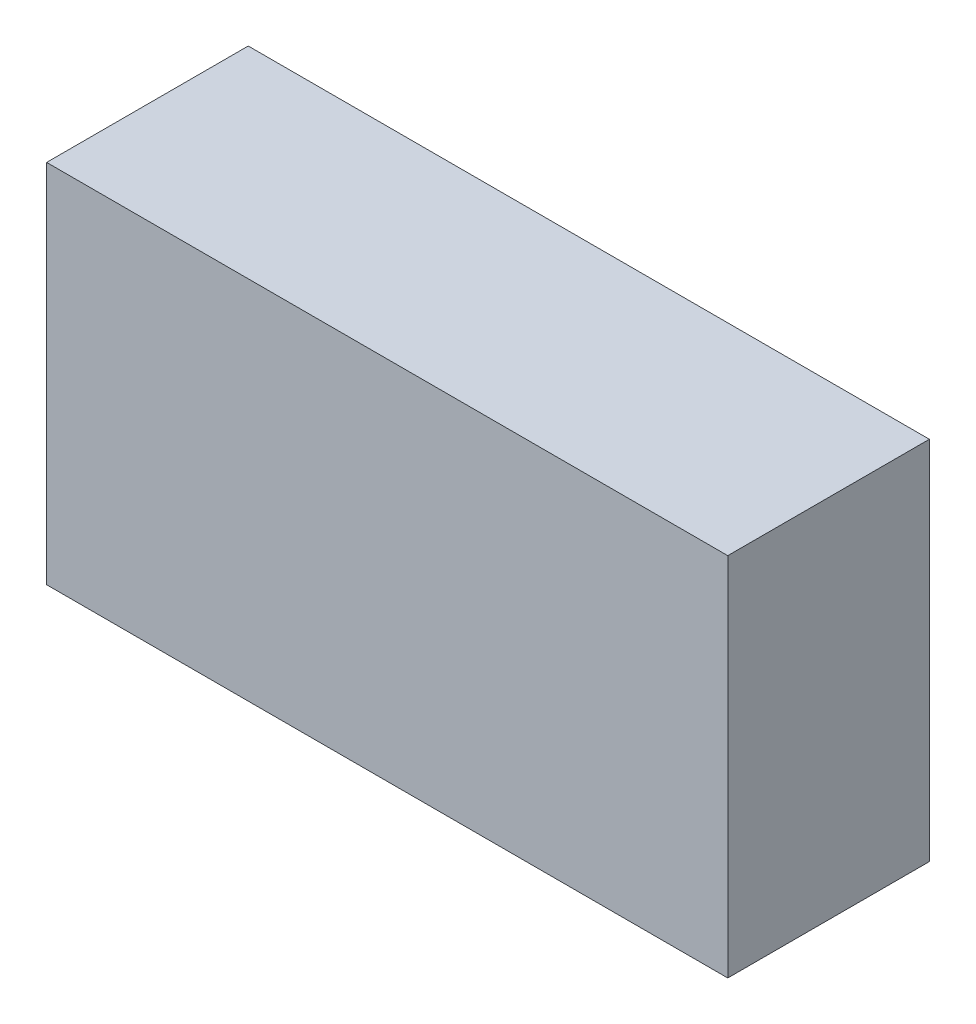
ISO-10303-21;
HEADER;
FILE_DESCRIPTION(('STEP AP214'),'2;1');
FILE_NAME('part.step','',(''),(''),'','','');
FILE_SCHEMA(('AUTOMOTIVE_DESIGN { 1 0 10303 214 1 1 1 1 }'));
ENDSEC;
DATA;
#1=APPLICATION_CONTEXT('core data for automotive mechanical design processes');
#2=APPLICATION_PROTOCOL_DEFINITION('international standard','automotive_design',2000,#1);
#3=PRODUCT_CONTEXT('',#1,'mechanical');
#4=PRODUCT('Part','Part','',(#3));
#5=PRODUCT_RELATED_PRODUCT_CATEGORY('part','',(#4));
#6=PRODUCT_DEFINITION_FORMATION('','',#4);
#7=PRODUCT_DEFINITION_CONTEXT('part definition',#1,'design');
#8=PRODUCT_DEFINITION('design','',#6,#7);
#9=PRODUCT_DEFINITION_SHAPE('','',#8);
#10=(LENGTH_UNIT() NAMED_UNIT(*) SI_UNIT(.MILLI.,.METRE.));
#11=(NAMED_UNIT(*) PLANE_ANGLE_UNIT() SI_UNIT($,.RADIAN.));
#12=(NAMED_UNIT(*) SI_UNIT($,.STERADIAN.) SOLID_ANGLE_UNIT());
#13=UNCERTAINTY_MEASURE_WITH_UNIT(LENGTH_MEASURE(1.E-05),#10,'distance_accuracy_value','');
#14=(GEOMETRIC_REPRESENTATION_CONTEXT(3) GLOBAL_UNCERTAINTY_ASSIGNED_CONTEXT((#13)) GLOBAL_UNIT_ASSIGNED_CONTEXT((#10,
#11,#12)) REPRESENTATION_CONTEXT('',''));
#15=CARTESIAN_POINT('',(0.,0.,0.));
#16=DIRECTION('',(0.,0.,1.));
#17=DIRECTION('',(1.,0.,0.));
#18=AXIS2_PLACEMENT_3D('',#15,#16,#17);
#19=CARTESIAN_POINT('',(-0.473,0.254,0.045));
#20=DIRECTION('',(0.,1.,0.));
#21=DIRECTION('',(1.,0.,0.));
#22=AXIS2_PLACEMENT_3D('',#19,#20,#21);
#23=PLANE('',#22);
#24=DIRECTION('',(0.,0.,1.));
#25=VECTOR('',#24,1.);
#26=CARTESIAN_POINT('',(-0.473,0.254,0.045));
#27=LINE('',#26,#25);
#28=CARTESIAN_POINT('',(-0.473,0.254,0.045));
#29=VERTEX_POINT('',#28);
#30=CARTESIAN_POINT('',(-0.473,0.254,0.325));
#31=VERTEX_POINT('',#30);
#32=EDGE_CURVE('E72',#29,#31,#27,.T.);
#33=ORIENTED_EDGE('',*,*,#32,.T.);
#34=DIRECTION('',(1.,0.,0.));
#35=VECTOR('',#34,1.);
#36=CARTESIAN_POINT('',(-0.473,0.254,0.325));
#37=LINE('',#36,#35);
#38=CARTESIAN_POINT('',(0.473,0.254,0.325));
#39=VERTEX_POINT('',#38);
#40=EDGE_CURVE('E92',#31,#39,#37,.T.);
#41=ORIENTED_EDGE('',*,*,#40,.T.);
#42=DIRECTION('',(0.,0.,1.));
#43=VECTOR('',#42,1.);
#44=CARTESIAN_POINT('',(0.473,0.254,0.045));
#45=LINE('',#44,#43);
#46=CARTESIAN_POINT('',(0.473,0.254,0.045));
#47=VERTEX_POINT('',#46);
#48=EDGE_CURVE('E11',#47,#39,#45,.T.);
#49=ORIENTED_EDGE('',*,*,#48,.F.);
#50=DIRECTION('',(1.,0.,0.));
#51=VECTOR('',#50,1.);
#52=CARTESIAN_POINT('',(-0.473,0.254,0.045));
#53=LINE('',#52,#51);
#54=EDGE_CURVE('E87',#29,#47,#53,.T.);
#55=ORIENTED_EDGE('',*,*,#54,.F.);
#56=EDGE_LOOP('',(#33,#41,#49,#55));
#57=FACE_BOUND('',#56,.T.);
#58=ADVANCED_FACE('F17',(#57),#23,.T.);
#59=CARTESIAN_POINT('',(0.473,0.254,0.045));
#60=DIRECTION('',(1.,0.,0.));
#61=DIRECTION('',(0.,1.,0.));
#62=AXIS2_PLACEMENT_3D('',#59,#60,#61);
#63=PLANE('',#62);
#64=ORIENTED_EDGE('',*,*,#48,.T.);
#65=DIRECTION('',(0.,-1.,0.));
#66=VECTOR('',#65,1.);
#67=CARTESIAN_POINT('',(0.473,0.254,0.325));
#68=LINE('',#67,#66);
#69=CARTESIAN_POINT('',(0.473,-0.254,0.325));
#70=VERTEX_POINT('',#69);
#71=EDGE_CURVE('E100',#39,#70,#68,.T.);
#72=ORIENTED_EDGE('',*,*,#71,.T.);
#73=DIRECTION('',(0.,0.,1.));
#74=VECTOR('',#73,1.);
#75=CARTESIAN_POINT('',(0.473,-0.254,0.045));
#76=LINE('',#75,#74);
#77=CARTESIAN_POINT('',(0.473,-0.254,0.045));
#78=VERTEX_POINT('',#77);
#79=EDGE_CURVE('E28',#78,#70,#76,.T.);
#80=ORIENTED_EDGE('',*,*,#79,.F.);
#81=DIRECTION('',(0.,-1.,0.));
#82=VECTOR('',#81,1.);
#83=CARTESIAN_POINT('',(0.473,0.254,0.045));
#84=LINE('',#83,#82);
#85=EDGE_CURVE('E91',#47,#78,#84,.T.);
#86=ORIENTED_EDGE('',*,*,#85,.F.);
#87=EDGE_LOOP('',(#64,#72,#80,#86));
#88=FACE_BOUND('',#87,.T.);
#89=ADVANCED_FACE('F118',(#88),#63,.T.);
#90=CARTESIAN_POINT('',(0.473,-0.254,0.045));
#91=DIRECTION('',(0.,-1.,0.));
#92=DIRECTION('',(0.,0.,-1.));
#93=AXIS2_PLACEMENT_3D('',#90,#91,#92);
#94=PLANE('',#93);
#95=ORIENTED_EDGE('',*,*,#79,.T.);
#96=DIRECTION('',(-1.,0.,0.));
#97=VECTOR('',#96,1.);
#98=CARTESIAN_POINT('',(0.473,-0.254,0.325));
#99=LINE('',#98,#97);
#100=CARTESIAN_POINT('',(-0.473,-0.254,0.325));
#101=VERTEX_POINT('',#100);
#102=EDGE_CURVE('E103',#70,#101,#99,.T.);
#103=ORIENTED_EDGE('',*,*,#102,.T.);
#104=DIRECTION('',(0.,0.,1.));
#105=VECTOR('',#104,1.);
#106=CARTESIAN_POINT('',(-0.473,-0.254,0.045));
#107=LINE('',#106,#105);
#108=CARTESIAN_POINT('',(-0.473,-0.254,0.045));
#109=VERTEX_POINT('',#108);
#110=EDGE_CURVE('E42',#109,#101,#107,.T.);
#111=ORIENTED_EDGE('',*,*,#110,.F.);
#112=DIRECTION('',(-1.,0.,0.));
#113=VECTOR('',#112,1.);
#114=CARTESIAN_POINT('',(0.473,-0.254,0.045));
#115=LINE('',#114,#113);
#116=EDGE_CURVE('E88',#78,#109,#115,.T.);
#117=ORIENTED_EDGE('',*,*,#116,.F.);
#118=EDGE_LOOP('',(#95,#103,#111,#117));
#119=FACE_BOUND('',#118,.T.);
#120=ADVANCED_FACE('F19',(#119),#94,.T.);
#121=CARTESIAN_POINT('',(-0.473,-0.254,0.045));
#122=DIRECTION('',(-1.,0.,0.));
#123=DIRECTION('',(0.,0.,1.));
#124=AXIS2_PLACEMENT_3D('',#121,#122,#123);
#125=PLANE('',#124);
#126=ORIENTED_EDGE('',*,*,#110,.T.);
#127=DIRECTION('',(0.,1.,0.));
#128=VECTOR('',#127,1.);
#129=CARTESIAN_POINT('',(-0.473,-0.254,0.325));
#130=LINE('',#129,#128);
#131=EDGE_CURVE('E77',#101,#31,#130,.T.);
#132=ORIENTED_EDGE('',*,*,#131,.T.);
#133=ORIENTED_EDGE('',*,*,#32,.F.);
#134=DIRECTION('',(0.,1.,0.));
#135=VECTOR('',#134,1.);
#136=CARTESIAN_POINT('',(-0.473,-0.254,0.045));
#137=LINE('',#136,#135);
#138=EDGE_CURVE('E21',#109,#29,#137,.T.);
#139=ORIENTED_EDGE('',*,*,#138,.F.);
#140=EDGE_LOOP('',(#126,#132,#133,#139));
#141=FACE_BOUND('',#140,.T.);
#142=ADVANCED_FACE('F74',(#141),#125,.T.);
#143=CARTESIAN_POINT('',(0.,0.,0.045));
#144=DIRECTION('',(0.,0.,-1.));
#145=DIRECTION('',(0.,-1.,0.));
#146=AXIS2_PLACEMENT_3D('',#143,#144,#145);
#147=PLANE('',#146);
#148=ORIENTED_EDGE('',*,*,#54,.T.);
#149=ORIENTED_EDGE('',*,*,#85,.T.);
#150=ORIENTED_EDGE('',*,*,#116,.T.);
#151=ORIENTED_EDGE('',*,*,#138,.T.);
#152=EDGE_LOOP('',(#148,#149,#150,#151));
#153=FACE_BOUND('',#152,.T.);
#154=ADVANCED_FACE('F85',(#153),#147,.T.);
#155=CARTESIAN_POINT('',(0.,0.,0.325));
#156=DIRECTION('',(0.,0.,-1.));
#157=DIRECTION('',(0.,-1.,0.));
#158=AXIS2_PLACEMENT_3D('',#155,#156,#157);
#159=PLANE('',#158);
#160=ORIENTED_EDGE('',*,*,#131,.F.);
#161=ORIENTED_EDGE('',*,*,#102,.F.);
#162=ORIENTED_EDGE('',*,*,#71,.F.);
#163=ORIENTED_EDGE('',*,*,#40,.F.);
#164=EDGE_LOOP('',(#160,#161,#162,#163));
#165=FACE_BOUND('',#164,.T.);
#166=ADVANCED_FACE('F120',(#165),#159,.F.);
#167=CLOSED_SHELL('',(#58,#89,#120,#142,#154,#166));
#168=MANIFOLD_SOLID_BREP('B1',#167);
#169=ADVANCED_BREP_SHAPE_REPRESENTATION('',(#18,#168),#14);
#170=SHAPE_DEFINITION_REPRESENTATION(#9,#169);
ENDSEC;
END-ISO-10303-21;
